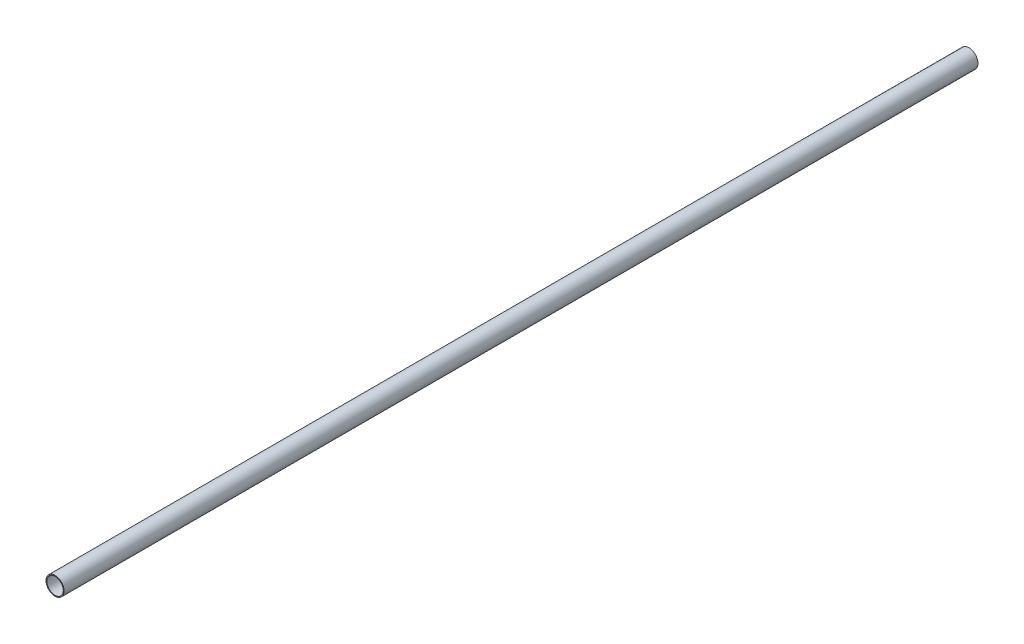
ISO-10303-21;
HEADER;
FILE_DESCRIPTION(('STEP AP214'),'2;1');
FILE_NAME('part.step','',(''),(''),'','','');
FILE_SCHEMA(('AUTOMOTIVE_DESIGN { 1 0 10303 214 1 1 1 1 }'));
ENDSEC;
DATA;
#1=APPLICATION_CONTEXT('core data for automotive mechanical design processes');
#2=APPLICATION_PROTOCOL_DEFINITION('international standard','automotive_design',2000,#1);
#3=PRODUCT_CONTEXT('',#1,'mechanical');
#4=PRODUCT('Part','Part','',(#3));
#5=PRODUCT_RELATED_PRODUCT_CATEGORY('part','',(#4));
#6=PRODUCT_DEFINITION_FORMATION('','',#4);
#7=PRODUCT_DEFINITION_CONTEXT('part definition',#1,'design');
#8=PRODUCT_DEFINITION('design','',#6,#7);
#9=PRODUCT_DEFINITION_SHAPE('','',#8);
#10=(LENGTH_UNIT() NAMED_UNIT(*) SI_UNIT(.MILLI.,.METRE.));
#11=(NAMED_UNIT(*) PLANE_ANGLE_UNIT() SI_UNIT($,.RADIAN.));
#12=(NAMED_UNIT(*) SI_UNIT($,.STERADIAN.) SOLID_ANGLE_UNIT());
#13=UNCERTAINTY_MEASURE_WITH_UNIT(LENGTH_MEASURE(1.E-05),#10,'distance_accuracy_value','');
#14=(GEOMETRIC_REPRESENTATION_CONTEXT(3) GLOBAL_UNCERTAINTY_ASSIGNED_CONTEXT((#13)) GLOBAL_UNIT_ASSIGNED_CONTEXT((#10,
#11,#12)) REPRESENTATION_CONTEXT('',''));
#15=CARTESIAN_POINT('',(0.,0.,0.));
#16=DIRECTION('',(0.,0.,1.));
#17=DIRECTION('',(1.,0.,0.));
#18=AXIS2_PLACEMENT_3D('',#15,#16,#17);
#19=CARTESIAN_POINT('',(0.,0.,200.));
#20=DIRECTION('',(0.,0.,1.));
#21=DIRECTION('',(1.,0.,0.));
#22=AXIS2_PLACEMENT_3D('',#19,#20,#21);
#23=PLANE('',#22);
#24=CARTESIAN_POINT('',(0.,0.,200.));
#25=DIRECTION('',(0.,0.,1.));
#26=DIRECTION('',(1.,0.,0.));
#27=AXIS2_PLACEMENT_3D('',#24,#25,#26);
#28=CIRCLE('',#27,1.984375);
#29=CARTESIAN_POINT('',(1.984375,0.,200.));
#30=VERTEX_POINT('',#29);
#31=EDGE_CURVE('E10',#30,#30,#28,.T.);
#32=ORIENTED_EDGE('',*,*,#31,.T.);
#33=EDGE_LOOP('',(#32));
#34=FACE_BOUND('',#33,.T.);
#35=CARTESIAN_POINT('',(0.,0.,200.));
#36=DIRECTION('',(0.,0.,1.));
#37=DIRECTION('',(1.,0.,0.));
#38=AXIS2_PLACEMENT_3D('',#35,#36,#37);
#39=CIRCLE('',#38,1.8);
#40=CARTESIAN_POINT('',(1.8,0.,200.));
#41=VERTEX_POINT('',#40);
#42=EDGE_CURVE('E41',#41,#41,#39,.T.);
#43=ORIENTED_EDGE('',*,*,#42,.F.);
#44=EDGE_LOOP('',(#43));
#45=FACE_BOUND('',#44,.T.);
#46=ADVANCED_FACE('F30',(#34,#45),#23,.T.);
#47=CARTESIAN_POINT('',(0.,0.,0.));
#48=DIRECTION('',(0.,0.,1.));
#49=DIRECTION('',(1.,0.,0.));
#50=AXIS2_PLACEMENT_3D('',#47,#48,#49);
#51=PLANE('',#50);
#52=CARTESIAN_POINT('',(0.,0.,0.));
#53=DIRECTION('',(0.,0.,1.));
#54=DIRECTION('',(1.,0.,0.));
#55=AXIS2_PLACEMENT_3D('',#52,#53,#54);
#56=CIRCLE('',#55,1.984375);
#57=CARTESIAN_POINT('',(1.984375,0.,0.));
#58=VERTEX_POINT('',#57);
#59=EDGE_CURVE('E34',#58,#58,#56,.T.);
#60=ORIENTED_EDGE('',*,*,#59,.F.);
#61=EDGE_LOOP('',(#60));
#62=FACE_BOUND('',#61,.T.);
#63=CARTESIAN_POINT('',(0.,0.,0.));
#64=DIRECTION('',(0.,0.,1.));
#65=DIRECTION('',(1.,0.,0.));
#66=AXIS2_PLACEMENT_3D('',#63,#64,#65);
#67=CIRCLE('',#66,1.8);
#68=CARTESIAN_POINT('',(1.8,0.,0.));
#69=VERTEX_POINT('',#68);
#70=EDGE_CURVE('E43',#69,#69,#67,.T.);
#71=ORIENTED_EDGE('',*,*,#70,.T.);
#72=EDGE_LOOP('',(#71));
#73=FACE_BOUND('',#72,.T.);
#74=ADVANCED_FACE('F53',(#62,#73),#51,.F.);
#75=CARTESIAN_POINT('',(0.,0.,200.));
#76=DIRECTION('',(0.,0.,-1.));
#77=DIRECTION('',(-1.,0.,0.));
#78=AXIS2_PLACEMENT_3D('',#75,#76,#77);
#79=CYLINDRICAL_SURFACE('',#78,1.984375);
#80=ORIENTED_EDGE('',*,*,#31,.F.);
#81=EDGE_LOOP('',(#80));
#82=FACE_BOUND('',#81,.T.);
#83=ORIENTED_EDGE('',*,*,#59,.T.);
#84=EDGE_LOOP('',(#83));
#85=FACE_BOUND('',#84,.T.);
#86=ADVANCED_FACE('F32',(#82,#85),#79,.T.);
#87=CARTESIAN_POINT('',(0.,0.,200.));
#88=DIRECTION('',(0.,0.,-1.));
#89=DIRECTION('',(-1.,0.,0.));
#90=AXIS2_PLACEMENT_3D('',#87,#88,#89);
#91=CYLINDRICAL_SURFACE('',#90,1.8);
#92=ORIENTED_EDGE('',*,*,#42,.T.);
#93=EDGE_LOOP('',(#92));
#94=FACE_BOUND('',#93,.T.);
#95=ORIENTED_EDGE('',*,*,#70,.F.);
#96=EDGE_LOOP('',(#95));
#97=FACE_BOUND('',#96,.T.);
#98=ADVANCED_FACE('F49',(#94,#97),#91,.F.);
#99=CLOSED_SHELL('',(#46,#74,#86,#98));
#100=MANIFOLD_SOLID_BREP('B2',#99);
#101=ADVANCED_BREP_SHAPE_REPRESENTATION('',(#18,#100),#14);
#102=SHAPE_DEFINITION_REPRESENTATION(#9,#101);
ENDSEC;
END-ISO-10303-21;
